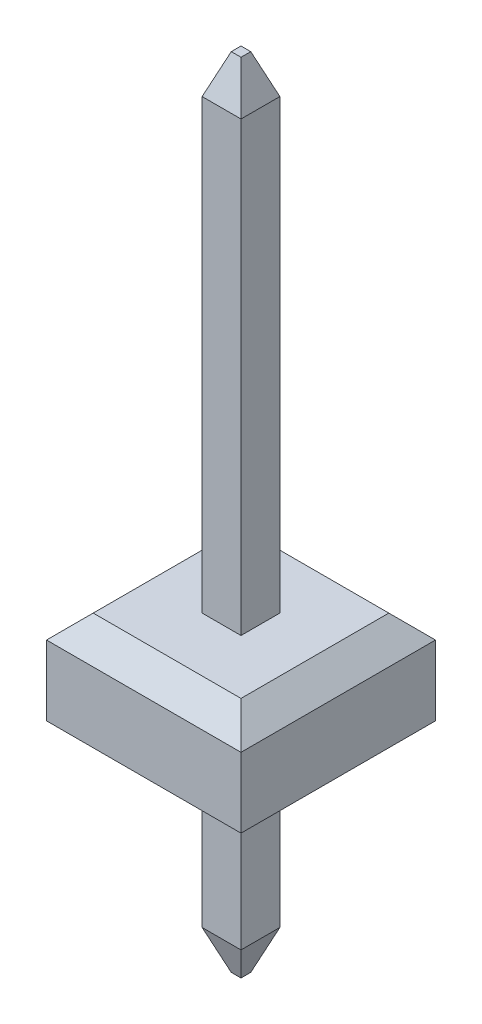
ISO-10303-21;
HEADER;
FILE_DESCRIPTION(('STEP AP214'),'2;1');
FILE_NAME('part.step','',(''),(''),'','','');
FILE_SCHEMA(('AUTOMOTIVE_DESIGN { 1 0 10303 214 1 1 1 1 }'));
ENDSEC;
DATA;
#1=APPLICATION_CONTEXT('core data for automotive mechanical design processes');
#2=APPLICATION_PROTOCOL_DEFINITION('international standard','automotive_design',2000,#1);
#3=PRODUCT_CONTEXT('',#1,'mechanical');
#4=PRODUCT('Part','Part','',(#3));
#5=PRODUCT_RELATED_PRODUCT_CATEGORY('part','',(#4));
#6=PRODUCT_DEFINITION_FORMATION('','',#4);
#7=PRODUCT_DEFINITION_CONTEXT('part definition',#1,'design');
#8=PRODUCT_DEFINITION('design','',#6,#7);
#9=PRODUCT_DEFINITION_SHAPE('','',#8);
#10=(LENGTH_UNIT() NAMED_UNIT(*) SI_UNIT(.MILLI.,.METRE.));
#11=(NAMED_UNIT(*) PLANE_ANGLE_UNIT() SI_UNIT($,.RADIAN.));
#12=(NAMED_UNIT(*) SI_UNIT($,.STERADIAN.) SOLID_ANGLE_UNIT());
#13=UNCERTAINTY_MEASURE_WITH_UNIT(LENGTH_MEASURE(1.E-05),#10,'distance_accuracy_value','');
#14=(GEOMETRIC_REPRESENTATION_CONTEXT(3) GLOBAL_UNCERTAINTY_ASSIGNED_CONTEXT((#13)) GLOBAL_UNIT_ASSIGNED_CONTEXT((#10,
#11,#12)) REPRESENTATION_CONTEXT('',''));
#15=CARTESIAN_POINT('',(0.,0.,0.));
#16=DIRECTION('',(0.,0.,1.));
#17=DIRECTION('',(1.,0.,0.));
#18=AXIS2_PLACEMENT_3D('',#15,#16,#17);
#19=CARTESIAN_POINT('',(0.,0.,0.));
#20=DIRECTION('',(0.,-1.,0.));
#21=DIRECTION('',(0.,0.,-1.));
#22=AXIS2_PLACEMENT_3D('',#19,#20,#21);
#23=PLANE('',#22);
#24=DIRECTION('',(1.,0.,0.));
#25=VECTOR('',#24,1.);
#26=CARTESIAN_POINT('',(2.54,0.,-2.2352));
#27=LINE('',#26,#25);
#28=CARTESIAN_POINT('',(0.3048,0.,-2.2352));
#29=VERTEX_POINT('',#28);
#30=CARTESIAN_POINT('',(2.2352,0.,-2.2352));
#31=VERTEX_POINT('',#30);
#32=EDGE_CURVE('E324',#29,#31,#27,.T.);
#33=ORIENTED_EDGE('',*,*,#32,.T.);
#34=DIRECTION('',(0.,0.,1.));
#35=VECTOR('',#34,1.);
#36=CARTESIAN_POINT('',(2.2352,0.,0.));
#37=LINE('',#36,#35);
#38=CARTESIAN_POINT('',(2.2352,0.,-0.3048));
#39=VERTEX_POINT('',#38);
#40=EDGE_CURVE('E326',#31,#39,#37,.T.);
#41=ORIENTED_EDGE('',*,*,#40,.T.);
#42=DIRECTION('',(-1.,0.,0.));
#43=VECTOR('',#42,1.);
#44=CARTESIAN_POINT('',(0.,0.,-0.3048));
#45=LINE('',#44,#43);
#46=CARTESIAN_POINT('',(0.3048,0.,-0.3048));
#47=VERTEX_POINT('',#46);
#48=EDGE_CURVE('E320',#39,#47,#45,.T.);
#49=ORIENTED_EDGE('',*,*,#48,.T.);
#50=DIRECTION('',(0.,0.,-1.));
#51=VECTOR('',#50,1.);
#52=CARTESIAN_POINT('',(0.3048,0.,-2.54));
#53=LINE('',#52,#51);
#54=EDGE_CURVE('E322',#47,#29,#53,.T.);
#55=ORIENTED_EDGE('',*,*,#54,.T.);
#56=EDGE_LOOP('',(#33,#41,#49,#55));
#57=FACE_BOUND('',#56,.T.);
#58=DIRECTION('',(0.,0.,1.));
#59=VECTOR('',#58,1.);
#60=CARTESIAN_POINT('',(1.524,0.,-1.524));
#61=LINE('',#60,#59);
#62=CARTESIAN_POINT('',(1.524,0.,-1.524));
#63=VERTEX_POINT('',#62);
#64=CARTESIAN_POINT('',(1.524,0.,-1.016));
#65=VERTEX_POINT('',#64);
#66=EDGE_CURVE('E179',#63,#65,#61,.T.);
#67=ORIENTED_EDGE('',*,*,#66,.F.);
#68=DIRECTION('',(1.,0.,0.));
#69=VECTOR('',#68,1.);
#70=CARTESIAN_POINT('',(1.016,0.,-1.524));
#71=LINE('',#70,#69);
#72=CARTESIAN_POINT('',(1.016,0.,-1.524));
#73=VERTEX_POINT('',#72);
#74=EDGE_CURVE('E188',#73,#63,#71,.T.);
#75=ORIENTED_EDGE('',*,*,#74,.F.);
#76=DIRECTION('',(0.,0.,-1.));
#77=VECTOR('',#76,1.);
#78=CARTESIAN_POINT('',(1.016,0.,-1.016));
#79=LINE('',#78,#77);
#80=CARTESIAN_POINT('',(1.016,0.,-1.016));
#81=VERTEX_POINT('',#80);
#82=EDGE_CURVE('E200',#81,#73,#79,.T.);
#83=ORIENTED_EDGE('',*,*,#82,.F.);
#84=DIRECTION('',(-1.,0.,0.));
#85=VECTOR('',#84,1.);
#86=CARTESIAN_POINT('',(1.524,0.,-1.016));
#87=LINE('',#86,#85);
#88=EDGE_CURVE('E198',#65,#81,#87,.T.);
#89=ORIENTED_EDGE('',*,*,#88,.F.);
#90=EDGE_LOOP('',(#67,#75,#83,#89));
#91=FACE_BOUND('',#90,.T.);
#92=ADVANCED_FACE('F33',(#57,#91),#23,.T.);
#93=CARTESIAN_POINT('',(0.,1.524,0.));
#94=DIRECTION('',(0.,-1.,0.));
#95=DIRECTION('',(0.,0.,-1.));
#96=AXIS2_PLACEMENT_3D('',#93,#94,#95);
#97=PLANE('',#96);
#98=DIRECTION('',(1.,0.,0.));
#99=VECTOR('',#98,1.);
#100=CARTESIAN_POINT('',(0.,1.524,-0.304799999999998));
#101=LINE('',#100,#99);
#102=CARTESIAN_POINT('',(0.304799999999998,1.524,-0.304799999999998));
#103=VERTEX_POINT('',#102);
#104=CARTESIAN_POINT('',(2.2352,1.524,-0.304799999999998));
#105=VERTEX_POINT('',#104);
#106=EDGE_CURVE('E280',#103,#105,#101,.T.);
#107=ORIENTED_EDGE('',*,*,#106,.T.);
#108=DIRECTION('',(0.,0.,-1.));
#109=VECTOR('',#108,1.);
#110=CARTESIAN_POINT('',(2.2352,1.524,0.));
#111=LINE('',#110,#109);
#112=CARTESIAN_POINT('',(2.2352,1.524,-2.2352));
#113=VERTEX_POINT('',#112);
#114=EDGE_CURVE('E296',#105,#113,#111,.T.);
#115=ORIENTED_EDGE('',*,*,#114,.T.);
#116=DIRECTION('',(-1.,0.,0.));
#117=VECTOR('',#116,1.);
#118=CARTESIAN_POINT('',(0.,1.524,-2.2352));
#119=LINE('',#118,#117);
#120=CARTESIAN_POINT('',(0.304799999999998,1.524,-2.2352));
#121=VERTEX_POINT('',#120);
#122=EDGE_CURVE('E294',#113,#121,#119,.T.);
#123=ORIENTED_EDGE('',*,*,#122,.T.);
#124=DIRECTION('',(0.,0.,1.));
#125=VECTOR('',#124,1.);
#126=CARTESIAN_POINT('',(0.304799999999998,1.524,0.));
#127=LINE('',#126,#125);
#128=EDGE_CURVE('E292',#121,#103,#127,.T.);
#129=ORIENTED_EDGE('',*,*,#128,.T.);
#130=EDGE_LOOP('',(#107,#115,#123,#129));
#131=FACE_BOUND('',#130,.T.);
#132=DIRECTION('',(0.,0.,1.));
#133=VECTOR('',#132,1.);
#134=CARTESIAN_POINT('',(1.016,1.524,-1.524));
#135=LINE('',#134,#133);
#136=CARTESIAN_POINT('',(1.016,1.524,-1.524));
#137=VERTEX_POINT('',#136);
#138=CARTESIAN_POINT('',(1.016,1.524,-1.016));
#139=VERTEX_POINT('',#138);
#140=EDGE_CURVE('E184',#137,#139,#135,.T.);
#141=ORIENTED_EDGE('',*,*,#140,.F.);
#142=DIRECTION('',(-1.,0.,0.));
#143=VECTOR('',#142,1.);
#144=CARTESIAN_POINT('',(1.524,1.524,-1.524));
#145=LINE('',#144,#143);
#146=CARTESIAN_POINT('',(1.524,1.524,-1.524));
#147=VERTEX_POINT('',#146);
#148=EDGE_CURVE('E216',#147,#137,#145,.T.);
#149=ORIENTED_EDGE('',*,*,#148,.F.);
#150=DIRECTION('',(0.,0.,-1.));
#151=VECTOR('',#150,1.);
#152=CARTESIAN_POINT('',(1.524,1.524,-1.524));
#153=LINE('',#152,#151);
#154=CARTESIAN_POINT('',(1.524,1.524,-1.016));
#155=VERTEX_POINT('',#154);
#156=EDGE_CURVE('E213',#155,#147,#153,.T.);
#157=ORIENTED_EDGE('',*,*,#156,.F.);
#158=DIRECTION('',(1.,0.,0.));
#159=VECTOR('',#158,1.);
#160=CARTESIAN_POINT('',(1.524,1.524,-1.016));
#161=LINE('',#160,#159);
#162=EDGE_CURVE('E210',#139,#155,#161,.T.);
#163=ORIENTED_EDGE('',*,*,#162,.F.);
#164=EDGE_LOOP('',(#141,#149,#157,#163));
#165=FACE_BOUND('',#164,.T.);
#166=ADVANCED_FACE('F384',(#131,#165),#97,.F.);
#167=CARTESIAN_POINT('',(0.,1.524,0.));
#168=DIRECTION('',(1.,0.,0.));
#169=DIRECTION('',(0.,0.,-1.));
#170=AXIS2_PLACEMENT_3D('',#167,#168,#169);
#171=PLANE('',#170);
#172=DIRECTION('',(0.,-1.,0.));
#173=VECTOR('',#172,1.);
#174=CARTESIAN_POINT('',(0.,1.524,-2.54));
#175=LINE('',#174,#173);
#176=CARTESIAN_POINT('',(0.,1.2192,-2.54));
#177=VERTEX_POINT('',#176);
#178=CARTESIAN_POINT('',(0.,0.3048,-2.54));
#179=VERTEX_POINT('',#178);
#180=EDGE_CURVE('E227',#177,#179,#175,.T.);
#181=ORIENTED_EDGE('',*,*,#180,.T.);
#182=DIRECTION('',(0.,0.,1.));
#183=VECTOR('',#182,1.);
#184=CARTESIAN_POINT('',(0.,0.304799999999999,0.));
#185=LINE('',#184,#183);
#186=CARTESIAN_POINT('',(0.,0.3048,0.));
#187=VERTEX_POINT('',#186);
#188=EDGE_CURVE('E42',#179,#187,#185,.T.);
#189=ORIENTED_EDGE('',*,*,#188,.T.);
#190=DIRECTION('',(0.,-1.,0.));
#191=VECTOR('',#190,1.);
#192=CARTESIAN_POINT('',(0.,1.524,0.));
#193=LINE('',#192,#191);
#194=CARTESIAN_POINT('',(0.,1.2192,0.));
#195=VERTEX_POINT('',#194);
#196=EDGE_CURVE('E234',#195,#187,#193,.T.);
#197=ORIENTED_EDGE('',*,*,#196,.F.);
#198=DIRECTION('',(0.,0.,-1.));
#199=VECTOR('',#198,1.);
#200=CARTESIAN_POINT('',(0.,1.2192,0.));
#201=LINE('',#200,#199);
#202=EDGE_CURVE('E304',#195,#177,#201,.T.);
#203=ORIENTED_EDGE('',*,*,#202,.T.);
#204=EDGE_LOOP('',(#181,#189,#197,#203));
#205=FACE_BOUND('',#204,.T.);
#206=ADVANCED_FACE('F375',(#205),#171,.F.);
#207=CARTESIAN_POINT('',(0.,1.524,0.));
#208=DIRECTION('',(0.,0.,-1.));
#209=DIRECTION('',(-1.,0.,0.));
#210=AXIS2_PLACEMENT_3D('',#207,#208,#209);
#211=PLANE('',#210);
#212=ORIENTED_EDGE('',*,*,#196,.T.);
#213=DIRECTION('',(1.,0.,0.));
#214=VECTOR('',#213,1.);
#215=CARTESIAN_POINT('',(2.54,0.304799999999999,0.));
#216=LINE('',#215,#214);
#217=CARTESIAN_POINT('',(2.54,0.3048,0.));
#218=VERTEX_POINT('',#217);
#219=EDGE_CURVE('E11',#187,#218,#216,.T.);
#220=ORIENTED_EDGE('',*,*,#219,.T.);
#221=DIRECTION('',(0.,-1.,0.));
#222=VECTOR('',#221,1.);
#223=CARTESIAN_POINT('',(2.54,1.524,0.));
#224=LINE('',#223,#222);
#225=CARTESIAN_POINT('',(2.54,1.2192,0.));
#226=VERTEX_POINT('',#225);
#227=EDGE_CURVE('E231',#226,#218,#224,.T.);
#228=ORIENTED_EDGE('',*,*,#227,.F.);
#229=DIRECTION('',(-1.,0.,0.));
#230=VECTOR('',#229,1.);
#231=CARTESIAN_POINT('',(0.,1.2192,0.));
#232=LINE('',#231,#230);
#233=EDGE_CURVE('E306',#226,#195,#232,.T.);
#234=ORIENTED_EDGE('',*,*,#233,.T.);
#235=EDGE_LOOP('',(#212,#220,#228,#234));
#236=FACE_BOUND('',#235,.T.);
#237=ADVANCED_FACE('F373',(#236),#211,.F.);
#238=CARTESIAN_POINT('',(2.54,1.524,0.));
#239=DIRECTION('',(-1.,0.,0.));
#240=DIRECTION('',(0.,0.,1.));
#241=AXIS2_PLACEMENT_3D('',#238,#239,#240);
#242=PLANE('',#241);
#243=ORIENTED_EDGE('',*,*,#227,.T.);
#244=DIRECTION('',(0.,0.,-1.));
#245=VECTOR('',#244,1.);
#246=CARTESIAN_POINT('',(2.54,0.304799999999999,-2.54));
#247=LINE('',#246,#245);
#248=CARTESIAN_POINT('',(2.54,0.3048,-2.54));
#249=VERTEX_POINT('',#248);
#250=EDGE_CURVE('E308',#218,#249,#247,.T.);
#251=ORIENTED_EDGE('',*,*,#250,.T.);
#252=DIRECTION('',(0.,-1.,0.));
#253=VECTOR('',#252,1.);
#254=CARTESIAN_POINT('',(2.54,1.524,-2.54));
#255=LINE('',#254,#253);
#256=CARTESIAN_POINT('',(2.54,1.2192,-2.54));
#257=VERTEX_POINT('',#256);
#258=EDGE_CURVE('E229',#257,#249,#255,.T.);
#259=ORIENTED_EDGE('',*,*,#258,.F.);
#260=DIRECTION('',(0.,0.,1.));
#261=VECTOR('',#260,1.);
#262=CARTESIAN_POINT('',(2.54,1.2192,0.));
#263=LINE('',#262,#261);
#264=EDGE_CURVE('E299',#257,#226,#263,.T.);
#265=ORIENTED_EDGE('',*,*,#264,.T.);
#266=EDGE_LOOP('',(#243,#251,#259,#265));
#267=FACE_BOUND('',#266,.T.);
#268=ADVANCED_FACE('F357',(#267),#242,.F.);
#269=CARTESIAN_POINT('',(0.,1.524,-2.54));
#270=DIRECTION('',(0.,0.,1.));
#271=DIRECTION('',(1.,0.,0.));
#272=AXIS2_PLACEMENT_3D('',#269,#270,#271);
#273=PLANE('',#272);
#274=ORIENTED_EDGE('',*,*,#258,.T.);
#275=DIRECTION('',(-1.,0.,0.));
#276=VECTOR('',#275,1.);
#277=CARTESIAN_POINT('',(0.,0.304799999999999,-2.54));
#278=LINE('',#277,#276);
#279=EDGE_CURVE('E57',#249,#179,#278,.T.);
#280=ORIENTED_EDGE('',*,*,#279,.T.);
#281=ORIENTED_EDGE('',*,*,#180,.F.);
#282=DIRECTION('',(1.,0.,0.));
#283=VECTOR('',#282,1.);
#284=CARTESIAN_POINT('',(0.,1.2192,-2.54));
#285=LINE('',#284,#283);
#286=EDGE_CURVE('E302',#177,#257,#285,.T.);
#287=ORIENTED_EDGE('',*,*,#286,.T.);
#288=EDGE_LOOP('',(#274,#280,#281,#287));
#289=FACE_BOUND('',#288,.T.);
#290=ADVANCED_FACE('F360',(#289),#273,.F.);
#291=CARTESIAN_POINT('',(1.016,7.874,-1.524));
#292=DIRECTION('',(1.,0.,0.));
#293=DIRECTION('',(0.,0.,-1.));
#294=AXIS2_PLACEMENT_3D('',#291,#292,#293);
#295=PLANE('',#294);
#296=DIRECTION('',(0.,-1.,0.));
#297=VECTOR('',#296,1.);
#298=CARTESIAN_POINT('',(1.016,7.874,-1.016));
#299=LINE('',#298,#297);
#300=CARTESIAN_POINT('',(1.016,7.36599999999999,-1.016));
#301=VERTEX_POINT('',#300);
#302=EDGE_CURVE('E225',#301,#139,#299,.T.);
#303=ORIENTED_EDGE('',*,*,#302,.F.);
#304=DIRECTION('',(0.,0.,-1.));
#305=VECTOR('',#304,1.);
#306=CARTESIAN_POINT('',(1.016,7.36599999999999,-1.524));
#307=LINE('',#306,#305);
#308=CARTESIAN_POINT('',(1.016,7.36599999999999,-1.524));
#309=VERTEX_POINT('',#308);
#310=EDGE_CURVE('E250',#301,#309,#307,.T.);
#311=ORIENTED_EDGE('',*,*,#310,.T.);
#312=DIRECTION('',(0.,-1.,0.));
#313=VECTOR('',#312,1.);
#314=CARTESIAN_POINT('',(1.016,7.874,-1.524));
#315=LINE('',#314,#313);
#316=EDGE_CURVE('E219',#309,#137,#315,.T.);
#317=ORIENTED_EDGE('',*,*,#316,.T.);
#318=ORIENTED_EDGE('',*,*,#140,.T.);
#319=EDGE_LOOP('',(#303,#311,#317,#318));
#320=FACE_BOUND('',#319,.T.);
#321=ADVANCED_FACE('F423',(#320),#295,.F.);
#322=CARTESIAN_POINT('',(1.524,7.874,-1.016));
#323=DIRECTION('',(0.,0.,-1.));
#324=DIRECTION('',(-1.,0.,0.));
#325=AXIS2_PLACEMENT_3D('',#322,#323,#324);
#326=PLANE('',#325);
#327=DIRECTION('',(0.,-1.,0.));
#328=VECTOR('',#327,1.);
#329=CARTESIAN_POINT('',(1.524,7.874,-1.016));
#330=LINE('',#329,#328);
#331=CARTESIAN_POINT('',(1.524,7.36599999999999,-1.016));
#332=VERTEX_POINT('',#331);
#333=EDGE_CURVE('E223',#332,#155,#330,.T.);
#334=ORIENTED_EDGE('',*,*,#333,.F.);
#335=DIRECTION('',(-1.,0.,0.));
#336=VECTOR('',#335,1.);
#337=CARTESIAN_POINT('',(1.524,7.36599999999999,-1.016));
#338=LINE('',#337,#336);
#339=EDGE_CURVE('E252',#332,#301,#338,.T.);
#340=ORIENTED_EDGE('',*,*,#339,.T.);
#341=ORIENTED_EDGE('',*,*,#302,.T.);
#342=ORIENTED_EDGE('',*,*,#162,.T.);
#343=EDGE_LOOP('',(#334,#340,#341,#342));
#344=FACE_BOUND('',#343,.T.);
#345=ADVANCED_FACE('F421',(#344),#326,.F.);
#346=CARTESIAN_POINT('',(1.524,7.874,-1.524));
#347=DIRECTION('',(-1.,0.,0.));
#348=DIRECTION('',(0.,0.,1.));
#349=AXIS2_PLACEMENT_3D('',#346,#347,#348);
#350=PLANE('',#349);
#351=DIRECTION('',(0.,-1.,0.));
#352=VECTOR('',#351,1.);
#353=CARTESIAN_POINT('',(1.524,7.874,-1.524));
#354=LINE('',#353,#352);
#355=CARTESIAN_POINT('',(1.524,7.36599999999999,-1.524));
#356=VERTEX_POINT('',#355);
#357=EDGE_CURVE('E221',#356,#147,#354,.T.);
#358=ORIENTED_EDGE('',*,*,#357,.F.);
#359=DIRECTION('',(0.,0.,1.));
#360=VECTOR('',#359,1.);
#361=CARTESIAN_POINT('',(1.524,7.36599999999999,-1.524));
#362=LINE('',#361,#360);
#363=EDGE_CURVE('E245',#356,#332,#362,.T.);
#364=ORIENTED_EDGE('',*,*,#363,.T.);
#365=ORIENTED_EDGE('',*,*,#333,.T.);
#366=ORIENTED_EDGE('',*,*,#156,.T.);
#367=EDGE_LOOP('',(#358,#364,#365,#366));
#368=FACE_BOUND('',#367,.T.);
#369=ADVANCED_FACE('F402',(#368),#350,.F.);
#370=CARTESIAN_POINT('',(1.524,7.874,-1.524));
#371=DIRECTION('',(0.,0.,1.));
#372=DIRECTION('',(1.,0.,0.));
#373=AXIS2_PLACEMENT_3D('',#370,#371,#372);
#374=PLANE('',#373);
#375=ORIENTED_EDGE('',*,*,#316,.F.);
#376=DIRECTION('',(1.,0.,0.));
#377=VECTOR('',#376,1.);
#378=CARTESIAN_POINT('',(1.524,7.36599999999999,-1.524));
#379=LINE('',#378,#377);
#380=EDGE_CURVE('E248',#309,#356,#379,.T.);
#381=ORIENTED_EDGE('',*,*,#380,.T.);
#382=ORIENTED_EDGE('',*,*,#357,.T.);
#383=ORIENTED_EDGE('',*,*,#148,.T.);
#384=EDGE_LOOP('',(#375,#381,#382,#383));
#385=FACE_BOUND('',#384,.T.);
#386=ADVANCED_FACE('F396',(#385),#374,.F.);
#387=CARTESIAN_POINT('',(0.,7.874,0.));
#388=DIRECTION('',(0.,-1.,0.));
#389=DIRECTION('',(0.,0.,-1.));
#390=AXIS2_PLACEMENT_3D('',#387,#388,#389);
#391=PLANE('',#390);
#392=DIRECTION('',(1.,0.,0.));
#393=VECTOR('',#392,1.);
#394=CARTESIAN_POINT('',(0.,7.874,-1.2065));
#395=LINE('',#394,#393);
#396=CARTESIAN_POINT('',(1.2065,7.874,-1.2065));
#397=VERTEX_POINT('',#396);
#398=CARTESIAN_POINT('',(1.3335,7.874,-1.2065));
#399=VERTEX_POINT('',#398);
#400=EDGE_CURVE('E236',#397,#399,#395,.T.);
#401=ORIENTED_EDGE('',*,*,#400,.T.);
#402=DIRECTION('',(0.,0.,-1.));
#403=VECTOR('',#402,1.);
#404=CARTESIAN_POINT('',(1.3335,7.874,0.));
#405=LINE('',#404,#403);
#406=CARTESIAN_POINT('',(1.3335,7.874,-1.3335));
#407=VERTEX_POINT('',#406);
#408=EDGE_CURVE('E242',#399,#407,#405,.T.);
#409=ORIENTED_EDGE('',*,*,#408,.T.);
#410=DIRECTION('',(-1.,0.,0.));
#411=VECTOR('',#410,1.);
#412=CARTESIAN_POINT('',(0.,7.874,-1.3335));
#413=LINE('',#412,#411);
#414=CARTESIAN_POINT('',(1.2065,7.874,-1.3335));
#415=VERTEX_POINT('',#414);
#416=EDGE_CURVE('E240',#407,#415,#413,.T.);
#417=ORIENTED_EDGE('',*,*,#416,.T.);
#418=DIRECTION('',(0.,0.,1.));
#419=VECTOR('',#418,1.);
#420=CARTESIAN_POINT('',(1.2065,7.874,0.));
#421=LINE('',#420,#419);
#422=EDGE_CURVE('E238',#415,#397,#421,.T.);
#423=ORIENTED_EDGE('',*,*,#422,.T.);
#424=EDGE_LOOP('',(#401,#409,#417,#423));
#425=FACE_BOUND('',#424,.T.);
#426=ADVANCED_FACE('F415',(#425),#391,.F.);
#427=CARTESIAN_POINT('',(1.016,-2.54,-1.524));
#428=DIRECTION('',(0.,0.,1.));
#429=DIRECTION('',(1.,0.,0.));
#430=AXIS2_PLACEMENT_3D('',#427,#428,#429);
#431=PLANE('',#430);
#432=DIRECTION('',(0.,1.,0.));
#433=VECTOR('',#432,1.);
#434=CARTESIAN_POINT('',(1.524,-2.54,-1.524));
#435=LINE('',#434,#433);
#436=CARTESIAN_POINT('',(1.524,-2.032,-1.524));
#437=VERTEX_POINT('',#436);
#438=EDGE_CURVE('E174',#437,#63,#435,.T.);
#439=ORIENTED_EDGE('',*,*,#438,.F.);
#440=DIRECTION('',(-1.,0.,0.));
#441=VECTOR('',#440,1.);
#442=CARTESIAN_POINT('',(1.016,-2.032,-1.524));
#443=LINE('',#442,#441);
#444=CARTESIAN_POINT('',(1.016,-2.032,-1.524));
#445=VERTEX_POINT('',#444);
#446=EDGE_CURVE('E274',#437,#445,#443,.T.);
#447=ORIENTED_EDGE('',*,*,#446,.T.);
#448=DIRECTION('',(0.,1.,0.));
#449=VECTOR('',#448,1.);
#450=CARTESIAN_POINT('',(1.016,-2.54,-1.524));
#451=LINE('',#450,#449);
#452=EDGE_CURVE('E191',#445,#73,#451,.T.);
#453=ORIENTED_EDGE('',*,*,#452,.T.);
#454=ORIENTED_EDGE('',*,*,#74,.T.);
#455=EDGE_LOOP('',(#439,#447,#453,#454));
#456=FACE_BOUND('',#455,.T.);
#457=ADVANCED_FACE('F189',(#456),#431,.F.);
#458=CARTESIAN_POINT('',(1.524,-2.54,-1.524));
#459=DIRECTION('',(-1.,0.,0.));
#460=DIRECTION('',(0.,0.,1.));
#461=AXIS2_PLACEMENT_3D('',#458,#459,#460);
#462=PLANE('',#461);
#463=DIRECTION('',(0.,1.,0.));
#464=VECTOR('',#463,1.);
#465=CARTESIAN_POINT('',(1.524,-2.54,-1.016));
#466=LINE('',#465,#464);
#467=CARTESIAN_POINT('',(1.524,-2.032,-1.016));
#468=VERTEX_POINT('',#467);
#469=EDGE_CURVE('E185',#468,#65,#466,.T.);
#470=ORIENTED_EDGE('',*,*,#469,.F.);
#471=DIRECTION('',(0.,0.,-1.));
#472=VECTOR('',#471,1.);
#473=CARTESIAN_POINT('',(1.524,-2.032,-1.524));
#474=LINE('',#473,#472);
#475=EDGE_CURVE('E182',#468,#437,#474,.T.);
#476=ORIENTED_EDGE('',*,*,#475,.T.);
#477=ORIENTED_EDGE('',*,*,#438,.T.);
#478=ORIENTED_EDGE('',*,*,#66,.T.);
#479=EDGE_LOOP('',(#470,#476,#477,#478));
#480=FACE_BOUND('',#479,.T.);
#481=ADVANCED_FACE('F177',(#480),#462,.F.);
#482=CARTESIAN_POINT('',(1.524,-2.54,-1.016));
#483=DIRECTION('',(0.,0.,-1.));
#484=DIRECTION('',(-1.,0.,0.));
#485=AXIS2_PLACEMENT_3D('',#482,#483,#484);
#486=PLANE('',#485);
#487=DIRECTION('',(0.,1.,0.));
#488=VECTOR('',#487,1.);
#489=CARTESIAN_POINT('',(1.016,-2.54,-1.016));
#490=LINE('',#489,#488);
#491=CARTESIAN_POINT('',(1.016,-2.032,-1.016));
#492=VERTEX_POINT('',#491);
#493=EDGE_CURVE('E205',#492,#81,#490,.T.);
#494=ORIENTED_EDGE('',*,*,#493,.F.);
#495=DIRECTION('',(1.,0.,0.));
#496=VECTOR('',#495,1.);
#497=CARTESIAN_POINT('',(1.524,-2.032,-1.016));
#498=LINE('',#497,#496);
#499=EDGE_CURVE('E278',#492,#468,#498,.T.);
#500=ORIENTED_EDGE('',*,*,#499,.T.);
#501=ORIENTED_EDGE('',*,*,#469,.T.);
#502=ORIENTED_EDGE('',*,*,#88,.T.);
#503=EDGE_LOOP('',(#494,#500,#501,#502));
#504=FACE_BOUND('',#503,.T.);
#505=ADVANCED_FACE('F593',(#504),#486,.F.);
#506=CARTESIAN_POINT('',(1.016,-2.54,-1.016));
#507=DIRECTION('',(1.,0.,0.));
#508=DIRECTION('',(0.,0.,-1.));
#509=AXIS2_PLACEMENT_3D('',#506,#507,#508);
#510=PLANE('',#509);
#511=ORIENTED_EDGE('',*,*,#452,.F.);
#512=DIRECTION('',(0.,0.,1.));
#513=VECTOR('',#512,1.);
#514=CARTESIAN_POINT('',(1.016,-2.032,-1.016));
#515=LINE('',#514,#513);
#516=EDGE_CURVE('E276',#445,#492,#515,.T.);
#517=ORIENTED_EDGE('',*,*,#516,.T.);
#518=ORIENTED_EDGE('',*,*,#493,.T.);
#519=ORIENTED_EDGE('',*,*,#82,.T.);
#520=EDGE_LOOP('',(#511,#517,#518,#519));
#521=FACE_BOUND('',#520,.T.);
#522=ADVANCED_FACE('F434',(#521),#510,.F.);
#523=CARTESIAN_POINT('',(0.,-2.54,0.));
#524=DIRECTION('',(0.,-1.,0.));
#525=DIRECTION('',(0.,0.,-1.));
#526=AXIS2_PLACEMENT_3D('',#523,#524,#525);
#527=PLANE('',#526);
#528=DIRECTION('',(1.,0.,0.));
#529=VECTOR('',#528,1.);
#530=CARTESIAN_POINT('',(1.524,-2.54,-1.3335));
#531=LINE('',#530,#529);
#532=CARTESIAN_POINT('',(1.2065,-2.54,-1.3335));
#533=VERTEX_POINT('',#532);
#534=CARTESIAN_POINT('',(1.3335,-2.54,-1.3335));
#535=VERTEX_POINT('',#534);
#536=EDGE_CURVE('E268',#533,#535,#531,.T.);
#537=ORIENTED_EDGE('',*,*,#536,.T.);
#538=DIRECTION('',(0.,0.,1.));
#539=VECTOR('',#538,1.);
#540=CARTESIAN_POINT('',(1.3335,-2.54,-1.016));
#541=LINE('',#540,#539);
#542=CARTESIAN_POINT('',(1.3335,-2.54,-1.2065));
#543=VERTEX_POINT('',#542);
#544=EDGE_CURVE('E270',#535,#543,#541,.T.);
#545=ORIENTED_EDGE('',*,*,#544,.T.);
#546=DIRECTION('',(-1.,0.,0.));
#547=VECTOR('',#546,1.);
#548=CARTESIAN_POINT('',(1.016,-2.54,-1.2065));
#549=LINE('',#548,#547);
#550=CARTESIAN_POINT('',(1.2065,-2.54,-1.2065));
#551=VERTEX_POINT('',#550);
#552=EDGE_CURVE('E254',#543,#551,#549,.T.);
#553=ORIENTED_EDGE('',*,*,#552,.T.);
#554=DIRECTION('',(0.,0.,-1.));
#555=VECTOR('',#554,1.);
#556=CARTESIAN_POINT('',(1.2065,-2.54,-1.524));
#557=LINE('',#556,#555);
#558=EDGE_CURVE('E266',#551,#533,#557,.T.);
#559=ORIENTED_EDGE('',*,*,#558,.T.);
#560=EDGE_LOOP('',(#537,#545,#553,#559));
#561=FACE_BOUND('',#560,.T.);
#562=ADVANCED_FACE('F427',(#561),#527,.T.);
#563=CARTESIAN_POINT('',(1.2065,7.874,0.));
#564=DIRECTION('',(0.936329177569045,-0.351123441588389,0.));
#565=DIRECTION('',(0.,0.,1.));
#566=AXIS2_PLACEMENT_3D('',#563,#564,#565);
#567=PLANE('',#566);
#568=DIRECTION('',(-0.331294578224537,-0.883452208598774,-0.331294578224537));
#569=VECTOR('',#568,1.);
#570=CARTESIAN_POINT('',(1.35285975609756,8.26429268292683,-1.18714024390244));
#571=LINE('',#570,#569);
#572=EDGE_CURVE('E260',#309,#415,#571,.F.);
#573=ORIENTED_EDGE('',*,*,#572,.F.);
#574=ORIENTED_EDGE('',*,*,#310,.F.);
#575=DIRECTION('',(-0.331294578224537,-0.883452208598774,0.331294578224537));
#576=VECTOR('',#575,1.);
#577=CARTESIAN_POINT('',(1.07407926829269,7.52087804878049,-1.07407926829269));
#578=LINE('',#577,#576);
#579=EDGE_CURVE('E195',#397,#301,#578,.T.);
#580=ORIENTED_EDGE('',*,*,#579,.F.);
#581=ORIENTED_EDGE('',*,*,#422,.F.);
#582=EDGE_LOOP('',(#573,#574,#580,#581));
#583=FACE_BOUND('',#582,.T.);
#584=ADVANCED_FACE('F425',(#583),#567,.F.);
#585=CARTESIAN_POINT('',(0.,7.874,-1.2065));
#586=DIRECTION('',(0.,-0.351123441588389,-0.936329177569045));
#587=DIRECTION('',(1.,0.,0.));
#588=AXIS2_PLACEMENT_3D('',#585,#586,#587);
#589=PLANE('',#588);
#590=ORIENTED_EDGE('',*,*,#579,.T.);
#591=ORIENTED_EDGE('',*,*,#339,.F.);
#592=DIRECTION('',(-0.331294578224537,0.883452208598774,-0.331294578224537));
#593=VECTOR('',#592,1.);
#594=CARTESIAN_POINT('',(1.18714024390244,8.26429268292683,-1.35285975609756));
#595=LINE('',#594,#593);
#596=EDGE_CURVE('E257',#399,#332,#595,.F.);
#597=ORIENTED_EDGE('',*,*,#596,.F.);
#598=ORIENTED_EDGE('',*,*,#400,.F.);
#599=EDGE_LOOP('',(#590,#591,#597,#598));
#600=FACE_BOUND('',#599,.T.);
#601=ADVANCED_FACE('F419',(#600),#589,.F.);
#602=CARTESIAN_POINT('',(0.,7.874,-1.3335));
#603=DIRECTION('',(0.,-0.351123441588389,0.936329177569045));
#604=DIRECTION('',(-1.,0.,0.));
#605=AXIS2_PLACEMENT_3D('',#602,#603,#604);
#606=PLANE('',#605);
#607=ORIENTED_EDGE('',*,*,#572,.T.);
#608=ORIENTED_EDGE('',*,*,#416,.F.);
#609=DIRECTION('',(0.331294578224537,-0.883452208598774,-0.331294578224537));
#610=VECTOR('',#609,1.);
#611=CARTESIAN_POINT('',(1.18714024390244,8.26429268292683,-1.18714024390244));
#612=LINE('',#611,#610);
#613=EDGE_CURVE('E255',#356,#407,#612,.F.);
#614=ORIENTED_EDGE('',*,*,#613,.F.);
#615=ORIENTED_EDGE('',*,*,#380,.F.);
#616=EDGE_LOOP('',(#607,#608,#614,#615));
#617=FACE_BOUND('',#616,.T.);
#618=ADVANCED_FACE('F412',(#617),#606,.F.);
#619=CARTESIAN_POINT('',(1.3335,7.874,0.));
#620=DIRECTION('',(-0.936329177569045,-0.351123441588389,0.));
#621=DIRECTION('',(0.,0.,-1.));
#622=AXIS2_PLACEMENT_3D('',#619,#620,#621);
#623=PLANE('',#622);
#624=ORIENTED_EDGE('',*,*,#596,.T.);
#625=ORIENTED_EDGE('',*,*,#363,.F.);
#626=ORIENTED_EDGE('',*,*,#613,.T.);
#627=ORIENTED_EDGE('',*,*,#408,.F.);
#628=EDGE_LOOP('',(#624,#625,#626,#627));
#629=FACE_BOUND('',#628,.T.);
#630=ADVANCED_FACE('F406',(#629),#623,.F.);
#631=CARTESIAN_POINT('',(1.2065,-2.54,0.));
#632=DIRECTION('',(-0.936329177569045,-0.351123441588389,0.));
#633=DIRECTION('',(0.,0.,1.));
#634=AXIS2_PLACEMENT_3D('',#631,#632,#633);
#635=PLANE('',#634);
#636=DIRECTION('',(0.331294578224537,-0.883452208598774,-0.331294578224537));
#637=VECTOR('',#636,1.);
#638=CARTESIAN_POINT('',(1.07407926829269,-2.18687804878049,-1.07407926829269));
#639=LINE('',#638,#637);
#640=EDGE_CURVE('E286',#492,#551,#639,.T.);
#641=ORIENTED_EDGE('',*,*,#640,.F.);
#642=ORIENTED_EDGE('',*,*,#516,.F.);
#643=DIRECTION('',(0.331294578224537,-0.883452208598774,0.331294578224537));
#644=VECTOR('',#643,1.);
#645=CARTESIAN_POINT('',(1.35285975609756,-2.93029268292683,-1.18714024390244));
#646=LINE('',#645,#644);
#647=EDGE_CURVE('E258',#533,#445,#646,.F.);
#648=ORIENTED_EDGE('',*,*,#647,.F.);
#649=ORIENTED_EDGE('',*,*,#558,.F.);
#650=EDGE_LOOP('',(#641,#642,#648,#649));
#651=FACE_BOUND('',#650,.T.);
#652=ADVANCED_FACE('F454',(#651),#635,.T.);
#653=CARTESIAN_POINT('',(0.,-2.54,-1.3335));
#654=DIRECTION('',(0.,-0.351123441588389,-0.936329177569045));
#655=DIRECTION('',(-1.,0.,0.));
#656=AXIS2_PLACEMENT_3D('',#653,#654,#655);
#657=PLANE('',#656);
#658=ORIENTED_EDGE('',*,*,#647,.T.);
#659=ORIENTED_EDGE('',*,*,#446,.F.);
#660=DIRECTION('',(-0.331294578224537,-0.883452208598774,0.331294578224537));
#661=VECTOR('',#660,1.);
#662=CARTESIAN_POINT('',(1.18714024390244,-2.93029268292683,-1.18714024390244));
#663=LINE('',#662,#661);
#664=EDGE_CURVE('E283',#535,#437,#663,.F.);
#665=ORIENTED_EDGE('',*,*,#664,.F.);
#666=ORIENTED_EDGE('',*,*,#536,.F.);
#667=EDGE_LOOP('',(#658,#659,#665,#666));
#668=FACE_BOUND('',#667,.T.);
#669=ADVANCED_FACE('F471',(#668),#657,.T.);
#670=CARTESIAN_POINT('',(0.,-2.54,-1.2065));
#671=DIRECTION('',(0.,-0.351123441588389,0.936329177569045));
#672=DIRECTION('',(1.,0.,0.));
#673=AXIS2_PLACEMENT_3D('',#670,#671,#672);
#674=PLANE('',#673);
#675=ORIENTED_EDGE('',*,*,#640,.T.);
#676=ORIENTED_EDGE('',*,*,#552,.F.);
#677=DIRECTION('',(0.331294578224537,0.883452208598774,0.331294578224537));
#678=VECTOR('',#677,1.);
#679=CARTESIAN_POINT('',(1.18714024390244,-2.93029268292683,-1.35285975609756));
#680=LINE('',#679,#678);
#681=EDGE_CURVE('E281',#468,#543,#680,.F.);
#682=ORIENTED_EDGE('',*,*,#681,.F.);
#683=ORIENTED_EDGE('',*,*,#499,.F.);
#684=EDGE_LOOP('',(#675,#676,#682,#683));
#685=FACE_BOUND('',#684,.T.);
#686=ADVANCED_FACE('F480',(#685),#674,.T.);
#687=CARTESIAN_POINT('',(1.3335,-2.54,0.));
#688=DIRECTION('',(0.936329177569045,-0.351123441588389,0.));
#689=DIRECTION('',(0.,0.,-1.));
#690=AXIS2_PLACEMENT_3D('',#687,#688,#689);
#691=PLANE('',#690);
#692=ORIENTED_EDGE('',*,*,#664,.T.);
#693=ORIENTED_EDGE('',*,*,#475,.F.);
#694=ORIENTED_EDGE('',*,*,#681,.T.);
#695=ORIENTED_EDGE('',*,*,#544,.F.);
#696=EDGE_LOOP('',(#692,#693,#694,#695));
#697=FACE_BOUND('',#696,.T.);
#698=ADVANCED_FACE('F488',(#697),#691,.T.);
#699=CARTESIAN_POINT('',(0.304799999999998,1.524,0.));
#700=DIRECTION('',(0.707106781186549,-0.707106781186546,0.));
#701=DIRECTION('',(0.,0.,1.));
#702=AXIS2_PLACEMENT_3D('',#699,#700,#701);
#703=PLANE('',#702);
#704=DIRECTION('',(-0.577350269189625,-0.577350269189627,-0.577350269189625));
#705=VECTOR('',#704,1.);
#706=CARTESIAN_POINT('',(1.04986666666666,2.26906666666667,-1.49013333333334));
#707=LINE('',#706,#705);
#708=EDGE_CURVE('E313',#177,#121,#707,.F.);
#709=ORIENTED_EDGE('',*,*,#708,.F.);
#710=ORIENTED_EDGE('',*,*,#202,.F.);
#711=DIRECTION('',(-0.577350269189625,-0.577350269189627,0.577350269189625));
#712=VECTOR('',#711,1.);
#713=CARTESIAN_POINT('',(0.203199999999999,1.4224,-0.203199999999999));
#714=LINE('',#713,#712);
#715=EDGE_CURVE('E284',#103,#195,#714,.T.);
#716=ORIENTED_EDGE('',*,*,#715,.F.);
#717=ORIENTED_EDGE('',*,*,#128,.F.);
#718=EDGE_LOOP('',(#709,#710,#716,#717));
#719=FACE_BOUND('',#718,.T.);
#720=ADVANCED_FACE('F378',(#719),#703,.F.);
#721=CARTESIAN_POINT('',(0.,1.524,-0.304799999999998));
#722=DIRECTION('',(0.,-0.707106781186546,-0.707106781186549));
#723=DIRECTION('',(1.,0.,0.));
#724=AXIS2_PLACEMENT_3D('',#721,#722,#723);
#725=PLANE('',#724);
#726=ORIENTED_EDGE('',*,*,#715,.T.);
#727=ORIENTED_EDGE('',*,*,#233,.F.);
#728=DIRECTION('',(-0.577350269189625,0.577350269189627,-0.577350269189625));
#729=VECTOR('',#728,1.);
#730=CARTESIAN_POINT('',(1.49013333333334,2.26906666666667,-1.04986666666666));
#731=LINE('',#730,#729);
#732=EDGE_CURVE('E311',#105,#226,#731,.F.);
#733=ORIENTED_EDGE('',*,*,#732,.F.);
#734=ORIENTED_EDGE('',*,*,#106,.F.);
#735=EDGE_LOOP('',(#726,#727,#733,#734));
#736=FACE_BOUND('',#735,.T.);
#737=ADVANCED_FACE('F382',(#736),#725,.F.);
#738=CARTESIAN_POINT('',(0.,1.524,-2.2352));
#739=DIRECTION('',(0.,-0.707106781186546,0.707106781186549));
#740=DIRECTION('',(-1.,0.,0.));
#741=AXIS2_PLACEMENT_3D('',#738,#739,#740);
#742=PLANE('',#741);
#743=ORIENTED_EDGE('',*,*,#708,.T.);
#744=ORIENTED_EDGE('',*,*,#122,.F.);
#745=DIRECTION('',(0.577350269189626,-0.577350269189627,-0.577350269189625));
#746=VECTOR('',#745,1.);
#747=CARTESIAN_POINT('',(1.49013333333334,2.26906666666667,-1.49013333333334));
#748=LINE('',#747,#746);
#749=EDGE_CURVE('E309',#257,#113,#748,.F.);
#750=ORIENTED_EDGE('',*,*,#749,.F.);
#751=ORIENTED_EDGE('',*,*,#286,.F.);
#752=EDGE_LOOP('',(#743,#744,#750,#751));
#753=FACE_BOUND('',#752,.T.);
#754=ADVANCED_FACE('F365',(#753),#742,.F.);
#755=CARTESIAN_POINT('',(2.2352,1.524,0.));
#756=DIRECTION('',(-0.707106781186549,-0.707106781186547,0.));
#757=DIRECTION('',(0.,0.,-1.));
#758=AXIS2_PLACEMENT_3D('',#755,#756,#757);
#759=PLANE('',#758);
#760=ORIENTED_EDGE('',*,*,#732,.T.);
#761=ORIENTED_EDGE('',*,*,#264,.F.);
#762=ORIENTED_EDGE('',*,*,#749,.T.);
#763=ORIENTED_EDGE('',*,*,#114,.F.);
#764=EDGE_LOOP('',(#760,#761,#762,#763));
#765=FACE_BOUND('',#764,.T.);
#766=ADVANCED_FACE('F369',(#765),#759,.F.);
#767=CARTESIAN_POINT('',(0.,0.304799999999999,0.));
#768=DIRECTION('',(-0.707106781186547,-0.707106781186548,0.));
#769=DIRECTION('',(0.,0.,-1.));
#770=AXIS2_PLACEMENT_3D('',#767,#768,#769);
#771=PLANE('',#770);
#772=DIRECTION('',(0.577350269189626,-0.577350269189625,0.577350269189626));
#773=VECTOR('',#772,1.);
#774=CARTESIAN_POINT('',(0.846666666666668,-0.541866666666667,-1.69333333333333));
#775=LINE('',#774,#773);
#776=EDGE_CURVE('E334',#29,#179,#775,.F.);
#777=ORIENTED_EDGE('',*,*,#776,.F.);
#778=ORIENTED_EDGE('',*,*,#54,.F.);
#779=DIRECTION('',(0.577350269189626,-0.577350269189625,-0.577350269189626));
#780=VECTOR('',#779,1.);
#781=CARTESIAN_POINT('',(0.,0.304799999999999,0.));
#782=LINE('',#781,#780);
#783=EDGE_CURVE('E37',#187,#47,#782,.T.);
#784=ORIENTED_EDGE('',*,*,#783,.F.);
#785=ORIENTED_EDGE('',*,*,#188,.F.);
#786=EDGE_LOOP('',(#777,#778,#784,#785));
#787=FACE_BOUND('',#786,.T.);
#788=ADVANCED_FACE('F35',(#787),#771,.T.);
#789=CARTESIAN_POINT('',(0.,0.304799999999999,0.));
#790=DIRECTION('',(0.,-0.707106781186548,0.707106781186547));
#791=DIRECTION('',(-1.,0.,0.));
#792=AXIS2_PLACEMENT_3D('',#789,#790,#791);
#793=PLANE('',#792);
#794=ORIENTED_EDGE('',*,*,#783,.T.);
#795=ORIENTED_EDGE('',*,*,#48,.F.);
#796=DIRECTION('',(0.577350269189626,0.577350269189625,0.577350269189626));
#797=VECTOR('',#796,1.);
#798=CARTESIAN_POINT('',(1.69333333333333,-0.541866666666667,-0.846666666666668));
#799=LINE('',#798,#797);
#800=EDGE_CURVE('E333',#218,#39,#799,.F.);
#801=ORIENTED_EDGE('',*,*,#800,.F.);
#802=ORIENTED_EDGE('',*,*,#219,.F.);
#803=EDGE_LOOP('',(#794,#795,#801,#802));
#804=FACE_BOUND('',#803,.T.);
#805=ADVANCED_FACE('F344',(#804),#793,.T.);
#806=CARTESIAN_POINT('',(0.,0.304799999999999,-2.54));
#807=DIRECTION('',(0.,-0.707106781186548,-0.707106781186547));
#808=DIRECTION('',(1.,0.,0.));
#809=AXIS2_PLACEMENT_3D('',#806,#807,#808);
#810=PLANE('',#809);
#811=ORIENTED_EDGE('',*,*,#776,.T.);
#812=ORIENTED_EDGE('',*,*,#279,.F.);
#813=DIRECTION('',(-0.577350269189627,-0.577350269189625,0.577350269189626));
#814=VECTOR('',#813,1.);
#815=CARTESIAN_POINT('',(1.69333333333333,-0.541866666666668,-1.69333333333333));
#816=LINE('',#815,#814);
#817=EDGE_CURVE('E331',#31,#249,#816,.F.);
#818=ORIENTED_EDGE('',*,*,#817,.F.);
#819=ORIENTED_EDGE('',*,*,#32,.F.);
#820=EDGE_LOOP('',(#811,#812,#818,#819));
#821=FACE_BOUND('',#820,.T.);
#822=ADVANCED_FACE('F354',(#821),#810,.T.);
#823=CARTESIAN_POINT('',(2.54,0.304799999999999,0.));
#824=DIRECTION('',(0.707106781186546,-0.707106781186548,0.));
#825=DIRECTION('',(0.,0.,1.));
#826=AXIS2_PLACEMENT_3D('',#823,#824,#825);
#827=PLANE('',#826);
#828=ORIENTED_EDGE('',*,*,#800,.T.);
#829=ORIENTED_EDGE('',*,*,#40,.F.);
#830=ORIENTED_EDGE('',*,*,#817,.T.);
#831=ORIENTED_EDGE('',*,*,#250,.F.);
#832=EDGE_LOOP('',(#828,#829,#830,#831));
#833=FACE_BOUND('',#832,.T.);
#834=ADVANCED_FACE('F352',(#833),#827,.T.);
#835=CLOSED_SHELL('',(#92,#166,#206,#237,#268,#290,#321,#345,#369,#386,#426,#457,#481,#505,#522,
#562,#584,#601,#618,#630,#652,#669,#686,#698,#720,#737,#754,#766,#788,#805,#822,#834));
#836=MANIFOLD_SOLID_BREP('B2',#835);
#837=ADVANCED_BREP_SHAPE_REPRESENTATION('',(#18,#836),#14);
#838=SHAPE_DEFINITION_REPRESENTATION(#9,#837);
ENDSEC;
END-ISO-10303-21;
